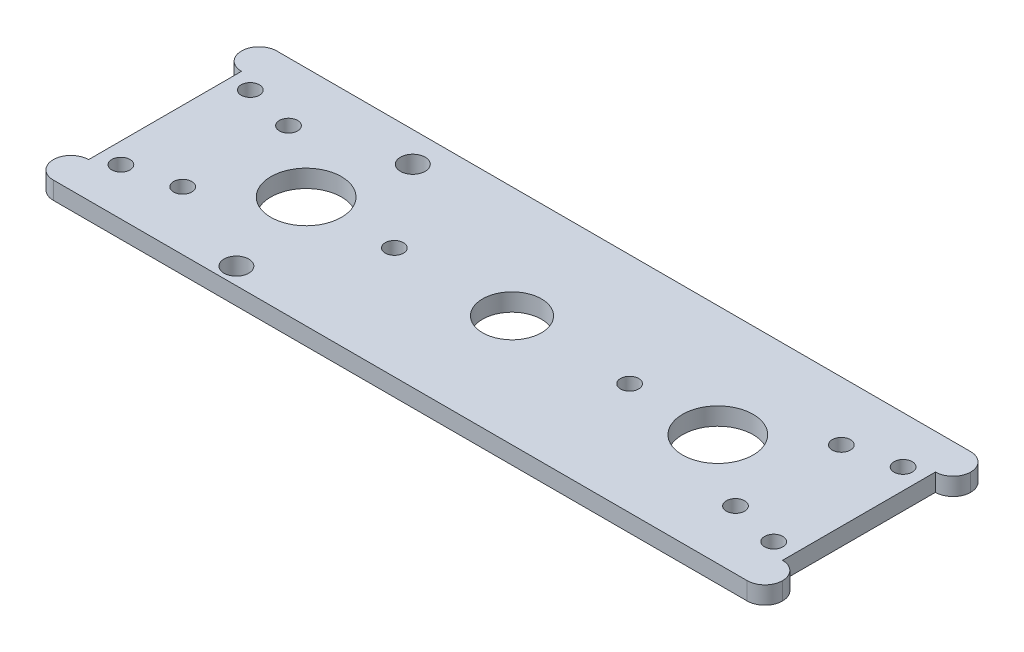
ISO-10303-21;
HEADER;
FILE_DESCRIPTION(('STEP AP214'),'2;1');
FILE_NAME('part.step','',(''),(''),'','','');
FILE_SCHEMA(('AUTOMOTIVE_DESIGN { 1 0 10303 214 1 1 1 1 }'));
ENDSEC;
DATA;
#1=APPLICATION_CONTEXT('core data for automotive mechanical design processes');
#2=APPLICATION_PROTOCOL_DEFINITION('international standard','automotive_design',2000,#1);
#3=PRODUCT_CONTEXT('',#1,'mechanical');
#4=PRODUCT('Part','Part','',(#3));
#5=PRODUCT_RELATED_PRODUCT_CATEGORY('part','',(#4));
#6=PRODUCT_DEFINITION_FORMATION('','',#4);
#7=PRODUCT_DEFINITION_CONTEXT('part definition',#1,'design');
#8=PRODUCT_DEFINITION('design','',#6,#7);
#9=PRODUCT_DEFINITION_SHAPE('','',#8);
#10=(LENGTH_UNIT() NAMED_UNIT(*) SI_UNIT(.MILLI.,.METRE.));
#11=(NAMED_UNIT(*) PLANE_ANGLE_UNIT() SI_UNIT($,.RADIAN.));
#12=(NAMED_UNIT(*) SI_UNIT($,.STERADIAN.) SOLID_ANGLE_UNIT());
#13=UNCERTAINTY_MEASURE_WITH_UNIT(LENGTH_MEASURE(1.E-05),#10,'distance_accuracy_value','');
#14=(GEOMETRIC_REPRESENTATION_CONTEXT(3) GLOBAL_UNCERTAINTY_ASSIGNED_CONTEXT((#13)) GLOBAL_UNIT_ASSIGNED_CONTEXT((#10,
#11,#12)) REPRESENTATION_CONTEXT('',''));
#15=CARTESIAN_POINT('',(0.,0.,0.));
#16=DIRECTION('',(0.,0.,1.));
#17=DIRECTION('',(1.,0.,0.));
#18=AXIS2_PLACEMENT_3D('',#15,#16,#17);
#19=CARTESIAN_POINT('',(0.,3.,0.));
#20=DIRECTION('',(0.,-1.,0.));
#21=DIRECTION('',(0.,0.,-1.));
#22=AXIS2_PLACEMENT_3D('',#19,#20,#21);
#23=PLANE('',#22);
#24=CARTESIAN_POINT('',(-30.748546153319,3.,-13.8850052095709));
#25=DIRECTION('',(0.,-1.,0.));
#26=DIRECTION('',(0.,0.,-1.));
#27=AXIS2_PLACEMENT_3D('',#24,#25,#26);
#28=CIRCLE('',#27,2.09999999999999);
#29=CARTESIAN_POINT('',(-30.748546153319,3.,-15.9850052095709));
#30=VERTEX_POINT('',#29);
#31=EDGE_CURVE('E194',#30,#30,#28,.T.);
#32=ORIENTED_EDGE('',*,*,#31,.T.);
#33=EDGE_LOOP('',(#32));
#34=FACE_BOUND('',#33,.T.);
#35=CARTESIAN_POINT('',(-30.748546153319,3.,16.1149947904292));
#36=DIRECTION('',(0.,-1.,0.));
#37=DIRECTION('',(0.,0.,-1.));
#38=AXIS2_PLACEMENT_3D('',#35,#36,#37);
#39=CIRCLE('',#38,2.09999999999999);
#40=CARTESIAN_POINT('',(-30.748546153319,3.,14.0149947904292));
#41=VERTEX_POINT('',#40);
#42=EDGE_CURVE('E199',#41,#41,#39,.T.);
#43=ORIENTED_EDGE('',*,*,#42,.T.);
#44=EDGE_LOOP('',(#43));
#45=FACE_BOUND('',#44,.T.);
#46=DIRECTION('',(-1.,0.,0.));
#47=VECTOR('',#46,1.);
#48=CARTESIAN_POINT('',(-62.,3.,-19.));
#49=LINE('',#48,#47);
#50=CARTESIAN_POINT('',(59.,3.,-19.));
#51=VERTEX_POINT('',#50);
#52=CARTESIAN_POINT('',(-59.,3.,-19.));
#53=VERTEX_POINT('',#52);
#54=EDGE_CURVE('E143',#51,#53,#49,.T.);
#55=ORIENTED_EDGE('',*,*,#54,.T.);
#56=CARTESIAN_POINT('',(-59.,3.,-16.));
#57=DIRECTION('',(0.,-1.,0.));
#58=DIRECTION('',(0.,0.,-1.));
#59=AXIS2_PLACEMENT_3D('',#56,#57,#58);
#60=CIRCLE('',#59,3.);
#61=CARTESIAN_POINT('',(-62.,3.,-16.));
#62=VERTEX_POINT('',#61);
#63=EDGE_CURVE('E128',#53,#62,#60,.F.);
#64=ORIENTED_EDGE('',*,*,#63,.T.);
#65=CARTESIAN_POINT('',(-59.,3.,-16.));
#66=DIRECTION('',(0.,-1.,0.));
#67=DIRECTION('',(0.,0.,-1.));
#68=AXIS2_PLACEMENT_3D('',#65,#66,#67);
#69=CIRCLE('',#68,3.);
#70=CARTESIAN_POINT('',(-59.,3.,-13.));
#71=VERTEX_POINT('',#70);
#72=EDGE_CURVE('E122',#62,#71,#69,.F.);
#73=ORIENTED_EDGE('',*,*,#72,.T.);
#74=DIRECTION('',(0.,0.,1.));
#75=VECTOR('',#74,1.);
#76=CARTESIAN_POINT('',(-59.,3.,-13.));
#77=LINE('',#76,#75);
#78=CARTESIAN_POINT('',(-59.,3.,13.));
#79=VERTEX_POINT('',#78);
#80=EDGE_CURVE('E126',#71,#79,#77,.T.);
#81=ORIENTED_EDGE('',*,*,#80,.T.);
#82=CARTESIAN_POINT('',(-59.,3.,16.));
#83=DIRECTION('',(0.,-1.,0.));
#84=DIRECTION('',(0.,0.,-1.));
#85=AXIS2_PLACEMENT_3D('',#82,#83,#84);
#86=CIRCLE('',#85,3.);
#87=CARTESIAN_POINT('',(-62.,3.,16.));
#88=VERTEX_POINT('',#87);
#89=EDGE_CURVE('E133',#79,#88,#86,.F.);
#90=ORIENTED_EDGE('',*,*,#89,.T.);
#91=CARTESIAN_POINT('',(-59.,3.,16.));
#92=DIRECTION('',(0.,-1.,0.));
#93=DIRECTION('',(0.,0.,-1.));
#94=AXIS2_PLACEMENT_3D('',#91,#92,#93);
#95=CIRCLE('',#94,3.);
#96=CARTESIAN_POINT('',(-59.,3.,19.));
#97=VERTEX_POINT('',#96);
#98=EDGE_CURVE('E180',#88,#97,#95,.F.);
#99=ORIENTED_EDGE('',*,*,#98,.T.);
#100=DIRECTION('',(1.,0.,0.));
#101=VECTOR('',#100,1.);
#102=CARTESIAN_POINT('',(-62.,3.,19.));
#103=LINE('',#102,#101);
#104=CARTESIAN_POINT('',(59.,3.,19.));
#105=VERTEX_POINT('',#104);
#106=EDGE_CURVE('E142',#97,#105,#103,.T.);
#107=ORIENTED_EDGE('',*,*,#106,.T.);
#108=CARTESIAN_POINT('',(59.,3.,16.));
#109=DIRECTION('',(0.,-1.,0.));
#110=DIRECTION('',(0.,0.,-1.));
#111=AXIS2_PLACEMENT_3D('',#108,#109,#110);
#112=CIRCLE('',#111,3.);
#113=CARTESIAN_POINT('',(62.,3.,16.));
#114=VERTEX_POINT('',#113);
#115=EDGE_CURVE('E50',#105,#114,#112,.F.);
#116=ORIENTED_EDGE('',*,*,#115,.T.);
#117=CARTESIAN_POINT('',(59.,3.,16.));
#118=DIRECTION('',(0.,-1.,0.));
#119=DIRECTION('',(0.,0.,-1.));
#120=AXIS2_PLACEMENT_3D('',#117,#118,#119);
#121=CIRCLE('',#120,3.);
#122=CARTESIAN_POINT('',(59.,3.,13.));
#123=VERTEX_POINT('',#122);
#124=EDGE_CURVE('E177',#114,#123,#121,.F.);
#125=ORIENTED_EDGE('',*,*,#124,.T.);
#126=DIRECTION('',(0.,0.,-1.));
#127=VECTOR('',#126,1.);
#128=CARTESIAN_POINT('',(59.,3.,-13.));
#129=LINE('',#128,#127);
#130=CARTESIAN_POINT('',(59.,3.,-13.));
#131=VERTEX_POINT('',#130);
#132=EDGE_CURVE('E289',#123,#131,#129,.T.);
#133=ORIENTED_EDGE('',*,*,#132,.T.);
#134=CARTESIAN_POINT('',(59.,3.,-16.));
#135=DIRECTION('',(0.,-1.,0.));
#136=DIRECTION('',(0.,0.,-1.));
#137=AXIS2_PLACEMENT_3D('',#134,#135,#136);
#138=CIRCLE('',#137,3.);
#139=CARTESIAN_POINT('',(62.,3.,-16.));
#140=VERTEX_POINT('',#139);
#141=EDGE_CURVE('E175',#131,#140,#138,.F.);
#142=ORIENTED_EDGE('',*,*,#141,.T.);
#143=CARTESIAN_POINT('',(59.,3.,-16.));
#144=DIRECTION('',(0.,-1.,0.));
#145=DIRECTION('',(0.,0.,-1.));
#146=AXIS2_PLACEMENT_3D('',#143,#144,#145);
#147=CIRCLE('',#146,3.);
#148=EDGE_CURVE('E173',#140,#51,#147,.F.);
#149=ORIENTED_EDGE('',*,*,#148,.T.);
#150=EDGE_LOOP('',(#55,#64,#73,#81,#90,#99,#107,#116,#125,#133,#142,#149));
#151=FACE_BOUND('',#150,.T.);
#152=CARTESIAN_POINT('',(0.,3.,0.));
#153=DIRECTION('',(0.,1.,0.));
#154=DIRECTION('',(0.,0.,1.));
#155=AXIS2_PLACEMENT_3D('',#152,#153,#154);
#156=CIRCLE('',#155,5.);
#157=CARTESIAN_POINT('',(0.,3.,5.));
#158=VERTEX_POINT('',#157);
#159=EDGE_CURVE('E280',#158,#158,#156,.T.);
#160=ORIENTED_EDGE('',*,*,#159,.F.);
#161=EDGE_LOOP('',(#160));
#162=FACE_BOUND('',#161,.T.);
#163=CARTESIAN_POINT('',(55.5,3.,-11.));
#164=DIRECTION('',(0.,1.,0.));
#165=DIRECTION('',(0.,0.,1.));
#166=AXIS2_PLACEMENT_3D('',#163,#164,#165);
#167=CIRCLE('',#166,1.54999999999999);
#168=CARTESIAN_POINT('',(55.5,3.,-9.45));
#169=VERTEX_POINT('',#168);
#170=EDGE_CURVE('E274',#169,#169,#167,.T.);
#171=ORIENTED_EDGE('',*,*,#170,.F.);
#172=EDGE_LOOP('',(#171));
#173=FACE_BOUND('',#172,.T.);
#174=CARTESIAN_POINT('',(-55.5,3.,-11.));
#175=DIRECTION('',(0.,1.,0.));
#176=DIRECTION('',(0.,0.,-1.));
#177=AXIS2_PLACEMENT_3D('',#174,#175,#176);
#178=CIRCLE('',#177,1.54999999999999);
#179=CARTESIAN_POINT('',(-55.5,3.,-12.55));
#180=VERTEX_POINT('',#179);
#181=EDGE_CURVE('E268',#180,#180,#178,.T.);
#182=ORIENTED_EDGE('',*,*,#181,.F.);
#183=EDGE_LOOP('',(#182));
#184=FACE_BOUND('',#183,.T.);
#185=CARTESIAN_POINT('',(-55.5,3.,11.));
#186=DIRECTION('',(0.,1.,0.));
#187=DIRECTION('',(0.,0.,1.));
#188=AXIS2_PLACEMENT_3D('',#185,#186,#187);
#189=CIRCLE('',#188,1.54999999999999);
#190=CARTESIAN_POINT('',(-55.5,3.,12.55));
#191=VERTEX_POINT('',#190);
#192=EDGE_CURVE('E262',#191,#191,#189,.T.);
#193=ORIENTED_EDGE('',*,*,#192,.F.);
#194=EDGE_LOOP('',(#193));
#195=FACE_BOUND('',#194,.T.);
#196=CARTESIAN_POINT('',(55.5,3.,11.));
#197=DIRECTION('',(0.,1.,0.));
#198=DIRECTION('',(0.,0.,-1.));
#199=AXIS2_PLACEMENT_3D('',#196,#197,#198);
#200=CIRCLE('',#199,1.54999999999999);
#201=CARTESIAN_POINT('',(55.5,3.,9.45));
#202=VERTEX_POINT('',#201);
#203=EDGE_CURVE('E256',#202,#202,#200,.T.);
#204=ORIENTED_EDGE('',*,*,#203,.F.);
#205=EDGE_LOOP('',(#204));
#206=FACE_BOUND('',#205,.T.);
#207=CARTESIAN_POINT('',(20.,3.,0.));
#208=DIRECTION('',(0.,1.,0.));
#209=DIRECTION('',(0.,0.,1.));
#210=AXIS2_PLACEMENT_3D('',#207,#208,#209);
#211=CIRCLE('',#210,1.55);
#212=CARTESIAN_POINT('',(20.,3.,1.55));
#213=VERTEX_POINT('',#212);
#214=EDGE_CURVE('E250',#213,#213,#211,.T.);
#215=ORIENTED_EDGE('',*,*,#214,.F.);
#216=EDGE_LOOP('',(#215));
#217=FACE_BOUND('',#216,.T.);
#218=CARTESIAN_POINT('',(-20.,3.,0.));
#219=DIRECTION('',(0.,1.,0.));
#220=DIRECTION('',(0.,0.,-1.));
#221=AXIS2_PLACEMENT_3D('',#218,#219,#220);
#222=CIRCLE('',#221,1.55);
#223=CARTESIAN_POINT('',(-20.,3.,-1.55));
#224=VERTEX_POINT('',#223);
#225=EDGE_CURVE('E244',#224,#224,#222,.T.);
#226=ORIENTED_EDGE('',*,*,#225,.F.);
#227=EDGE_LOOP('',(#226));
#228=FACE_BOUND('',#227,.T.);
#229=CARTESIAN_POINT('',(35.,3.,0.));
#230=DIRECTION('',(0.,1.,0.));
#231=DIRECTION('',(0.,0.,1.));
#232=AXIS2_PLACEMENT_3D('',#229,#230,#231);
#233=CIRCLE('',#232,6.);
#234=CARTESIAN_POINT('',(35.,3.,6.));
#235=VERTEX_POINT('',#234);
#236=EDGE_CURVE('E238',#235,#235,#233,.T.);
#237=ORIENTED_EDGE('',*,*,#236,.F.);
#238=EDGE_LOOP('',(#237));
#239=FACE_BOUND('',#238,.T.);
#240=CARTESIAN_POINT('',(-35.,3.,0.));
#241=DIRECTION('',(0.,1.,0.));
#242=DIRECTION('',(0.,0.,-1.));
#243=AXIS2_PLACEMENT_3D('',#240,#241,#242);
#244=CIRCLE('',#243,6.);
#245=CARTESIAN_POINT('',(-35.,3.,-6.));
#246=VERTEX_POINT('',#245);
#247=EDGE_CURVE('E232',#246,#246,#244,.T.);
#248=ORIENTED_EDGE('',*,*,#247,.F.);
#249=EDGE_LOOP('',(#248));
#250=FACE_BOUND('',#249,.T.);
#251=CARTESIAN_POINT('',(47.,3.,-9.));
#252=DIRECTION('',(0.,1.,0.));
#253=DIRECTION('',(0.,0.,1.));
#254=AXIS2_PLACEMENT_3D('',#251,#252,#253);
#255=CIRCLE('',#254,1.55);
#256=CARTESIAN_POINT('',(47.,3.,-7.45));
#257=VERTEX_POINT('',#256);
#258=EDGE_CURVE('E226',#257,#257,#255,.T.);
#259=ORIENTED_EDGE('',*,*,#258,.F.);
#260=EDGE_LOOP('',(#259));
#261=FACE_BOUND('',#260,.T.);
#262=CARTESIAN_POINT('',(47.,3.,9.));
#263=DIRECTION('',(0.,1.,0.));
#264=DIRECTION('',(0.,0.,-1.));
#265=AXIS2_PLACEMENT_3D('',#262,#263,#264);
#266=CIRCLE('',#265,1.55);
#267=CARTESIAN_POINT('',(47.,3.,7.45));
#268=VERTEX_POINT('',#267);
#269=EDGE_CURVE('E220',#268,#268,#266,.T.);
#270=ORIENTED_EDGE('',*,*,#269,.F.);
#271=EDGE_LOOP('',(#270));
#272=FACE_BOUND('',#271,.T.);
#273=CARTESIAN_POINT('',(-47.,3.,9.));
#274=DIRECTION('',(0.,1.,0.));
#275=DIRECTION('',(0.,0.,1.));
#276=AXIS2_PLACEMENT_3D('',#273,#274,#275);
#277=CIRCLE('',#276,1.55);
#278=CARTESIAN_POINT('',(-47.,3.,10.55));
#279=VERTEX_POINT('',#278);
#280=EDGE_CURVE('E214',#279,#279,#277,.T.);
#281=ORIENTED_EDGE('',*,*,#280,.F.);
#282=EDGE_LOOP('',(#281));
#283=FACE_BOUND('',#282,.T.);
#284=CARTESIAN_POINT('',(-47.,3.,-9.));
#285=DIRECTION('',(0.,1.,0.));
#286=DIRECTION('',(0.,0.,-1.));
#287=AXIS2_PLACEMENT_3D('',#284,#285,#286);
#288=CIRCLE('',#287,1.55);
#289=CARTESIAN_POINT('',(-47.,3.,-10.55));
#290=VERTEX_POINT('',#289);
#291=EDGE_CURVE('E208',#290,#290,#288,.T.);
#292=ORIENTED_EDGE('',*,*,#291,.F.);
#293=EDGE_LOOP('',(#292));
#294=FACE_BOUND('',#293,.T.);
#295=ADVANCED_FACE('F33',(#34,#45,#151,#162,#173,#184,#195,#206,#217,#228,#239,#250,#261,#272,
#283,#294),#23,.F.);
#296=CARTESIAN_POINT('',(0.,0.,0.));
#297=DIRECTION('',(0.,-1.,0.));
#298=DIRECTION('',(0.,0.,-1.));
#299=AXIS2_PLACEMENT_3D('',#296,#297,#298);
#300=PLANE('',#299);
#301=CARTESIAN_POINT('',(-30.748546153319,0.,-13.8850052095709));
#302=DIRECTION('',(0.,-1.,0.));
#303=DIRECTION('',(0.,0.,-1.));
#304=AXIS2_PLACEMENT_3D('',#301,#302,#303);
#305=CIRCLE('',#304,2.09999999999999);
#306=CARTESIAN_POINT('',(-30.748546153319,0.,-15.9850052095709));
#307=VERTEX_POINT('',#306);
#308=EDGE_CURVE('E204',#307,#307,#305,.T.);
#309=ORIENTED_EDGE('',*,*,#308,.F.);
#310=EDGE_LOOP('',(#309));
#311=FACE_BOUND('',#310,.T.);
#312=CARTESIAN_POINT('',(-30.748546153319,0.,16.1149947904292));
#313=DIRECTION('',(0.,-1.,0.));
#314=DIRECTION('',(0.,0.,-1.));
#315=AXIS2_PLACEMENT_3D('',#312,#313,#314);
#316=CIRCLE('',#315,2.09999999999999);
#317=CARTESIAN_POINT('',(-30.748546153319,0.,14.0149947904292));
#318=VERTEX_POINT('',#317);
#319=EDGE_CURVE('E539',#318,#318,#316,.T.);
#320=ORIENTED_EDGE('',*,*,#319,.F.);
#321=EDGE_LOOP('',(#320));
#322=FACE_BOUND('',#321,.T.);
#323=CARTESIAN_POINT('',(-47.,0.,9.));
#324=DIRECTION('',(0.,1.,0.));
#325=DIRECTION('',(0.,0.,1.));
#326=AXIS2_PLACEMENT_3D('',#323,#324,#325);
#327=CIRCLE('',#326,1.55);
#328=CARTESIAN_POINT('',(-47.,0.,10.55));
#329=VERTEX_POINT('',#328);
#330=EDGE_CURVE('E211',#329,#329,#327,.T.);
#331=ORIENTED_EDGE('',*,*,#330,.T.);
#332=EDGE_LOOP('',(#331));
#333=FACE_BOUND('',#332,.T.);
#334=CARTESIAN_POINT('',(47.,0.,-9.));
#335=DIRECTION('',(0.,1.,0.));
#336=DIRECTION('',(0.,0.,1.));
#337=AXIS2_PLACEMENT_3D('',#334,#335,#336);
#338=CIRCLE('',#337,1.55);
#339=CARTESIAN_POINT('',(47.,0.,-7.45));
#340=VERTEX_POINT('',#339);
#341=EDGE_CURVE('E223',#340,#340,#338,.T.);
#342=ORIENTED_EDGE('',*,*,#341,.T.);
#343=EDGE_LOOP('',(#342));
#344=FACE_BOUND('',#343,.T.);
#345=CARTESIAN_POINT('',(35.,0.,0.));
#346=DIRECTION('',(0.,1.,0.));
#347=DIRECTION('',(0.,0.,1.));
#348=AXIS2_PLACEMENT_3D('',#345,#346,#347);
#349=CIRCLE('',#348,6.);
#350=CARTESIAN_POINT('',(35.,0.,6.));
#351=VERTEX_POINT('',#350);
#352=EDGE_CURVE('E235',#351,#351,#349,.T.);
#353=ORIENTED_EDGE('',*,*,#352,.T.);
#354=EDGE_LOOP('',(#353));
#355=FACE_BOUND('',#354,.T.);
#356=CARTESIAN_POINT('',(20.,0.,0.));
#357=DIRECTION('',(0.,1.,0.));
#358=DIRECTION('',(0.,0.,1.));
#359=AXIS2_PLACEMENT_3D('',#356,#357,#358);
#360=CIRCLE('',#359,1.55);
#361=CARTESIAN_POINT('',(20.,0.,1.55));
#362=VERTEX_POINT('',#361);
#363=EDGE_CURVE('E247',#362,#362,#360,.T.);
#364=ORIENTED_EDGE('',*,*,#363,.T.);
#365=EDGE_LOOP('',(#364));
#366=FACE_BOUND('',#365,.T.);
#367=CARTESIAN_POINT('',(-55.5,0.,11.));
#368=DIRECTION('',(0.,1.,0.));
#369=DIRECTION('',(0.,0.,1.));
#370=AXIS2_PLACEMENT_3D('',#367,#368,#369);
#371=CIRCLE('',#370,1.54999999999999);
#372=CARTESIAN_POINT('',(-55.5,0.,12.55));
#373=VERTEX_POINT('',#372);
#374=EDGE_CURVE('E259',#373,#373,#371,.T.);
#375=ORIENTED_EDGE('',*,*,#374,.T.);
#376=EDGE_LOOP('',(#375));
#377=FACE_BOUND('',#376,.T.);
#378=CARTESIAN_POINT('',(55.5,0.,-11.));
#379=DIRECTION('',(0.,1.,0.));
#380=DIRECTION('',(0.,0.,1.));
#381=AXIS2_PLACEMENT_3D('',#378,#379,#380);
#382=CIRCLE('',#381,1.54999999999999);
#383=CARTESIAN_POINT('',(55.5,0.,-9.45));
#384=VERTEX_POINT('',#383);
#385=EDGE_CURVE('E271',#384,#384,#382,.T.);
#386=ORIENTED_EDGE('',*,*,#385,.T.);
#387=EDGE_LOOP('',(#386));
#388=FACE_BOUND('',#387,.T.);
#389=CARTESIAN_POINT('',(-59.,0.,-16.));
#390=DIRECTION('',(0.,-1.,0.));
#391=DIRECTION('',(0.,0.,-1.));
#392=AXIS2_PLACEMENT_3D('',#389,#390,#391);
#393=CIRCLE('',#392,3.);
#394=CARTESIAN_POINT('',(-59.,0.,-13.));
#395=VERTEX_POINT('',#394);
#396=CARTESIAN_POINT('',(-62.,0.,-16.));
#397=VERTEX_POINT('',#396);
#398=EDGE_CURVE('E147',#395,#397,#393,.T.);
#399=ORIENTED_EDGE('',*,*,#398,.T.);
#400=CARTESIAN_POINT('',(-59.,0.,-16.));
#401=DIRECTION('',(0.,-1.,0.));
#402=DIRECTION('',(0.,0.,-1.));
#403=AXIS2_PLACEMENT_3D('',#400,#401,#402);
#404=CIRCLE('',#403,3.);
#405=CARTESIAN_POINT('',(-59.,0.,-19.));
#406=VERTEX_POINT('',#405);
#407=EDGE_CURVE('E166',#397,#406,#404,.T.);
#408=ORIENTED_EDGE('',*,*,#407,.T.);
#409=DIRECTION('',(-1.,0.,0.));
#410=VECTOR('',#409,1.);
#411=CARTESIAN_POINT('',(-62.,0.,-19.));
#412=LINE('',#411,#410);
#413=CARTESIAN_POINT('',(59.,0.,-19.));
#414=VERTEX_POINT('',#413);
#415=EDGE_CURVE('E283',#414,#406,#412,.T.);
#416=ORIENTED_EDGE('',*,*,#415,.F.);
#417=CARTESIAN_POINT('',(59.,0.,-16.));
#418=DIRECTION('',(0.,-1.,0.));
#419=DIRECTION('',(0.,0.,-1.));
#420=AXIS2_PLACEMENT_3D('',#417,#418,#419);
#421=CIRCLE('',#420,3.);
#422=CARTESIAN_POINT('',(62.,0.,-16.));
#423=VERTEX_POINT('',#422);
#424=EDGE_CURVE('E148',#414,#423,#421,.T.);
#425=ORIENTED_EDGE('',*,*,#424,.T.);
#426=CARTESIAN_POINT('',(59.,0.,-16.));
#427=DIRECTION('',(0.,-1.,0.));
#428=DIRECTION('',(0.,0.,-1.));
#429=AXIS2_PLACEMENT_3D('',#426,#427,#428);
#430=CIRCLE('',#429,3.);
#431=CARTESIAN_POINT('',(59.,0.,-13.));
#432=VERTEX_POINT('',#431);
#433=EDGE_CURVE('E150',#423,#432,#430,.T.);
#434=ORIENTED_EDGE('',*,*,#433,.T.);
#435=DIRECTION('',(0.,0.,-1.));
#436=VECTOR('',#435,1.);
#437=CARTESIAN_POINT('',(59.,0.,-13.));
#438=LINE('',#437,#436);
#439=CARTESIAN_POINT('',(59.,0.,13.));
#440=VERTEX_POINT('',#439);
#441=EDGE_CURVE('E286',#440,#432,#438,.T.);
#442=ORIENTED_EDGE('',*,*,#441,.F.);
#443=CARTESIAN_POINT('',(59.,0.,16.));
#444=DIRECTION('',(0.,-1.,0.));
#445=DIRECTION('',(0.,0.,-1.));
#446=AXIS2_PLACEMENT_3D('',#443,#444,#445);
#447=CIRCLE('',#446,3.);
#448=CARTESIAN_POINT('',(62.,0.,16.));
#449=VERTEX_POINT('',#448);
#450=EDGE_CURVE('E157',#440,#449,#447,.T.);
#451=ORIENTED_EDGE('',*,*,#450,.T.);
#452=CARTESIAN_POINT('',(59.,0.,16.));
#453=DIRECTION('',(0.,-1.,0.));
#454=DIRECTION('',(0.,0.,-1.));
#455=AXIS2_PLACEMENT_3D('',#452,#453,#454);
#456=CIRCLE('',#455,3.);
#457=CARTESIAN_POINT('',(59.,0.,19.));
#458=VERTEX_POINT('',#457);
#459=EDGE_CURVE('E159',#449,#458,#456,.T.);
#460=ORIENTED_EDGE('',*,*,#459,.T.);
#461=DIRECTION('',(1.,0.,0.));
#462=VECTOR('',#461,1.);
#463=CARTESIAN_POINT('',(-62.,0.,19.));
#464=LINE('',#463,#462);
#465=CARTESIAN_POINT('',(-59.,0.,19.));
#466=VERTEX_POINT('',#465);
#467=EDGE_CURVE('E297',#466,#458,#464,.T.);
#468=ORIENTED_EDGE('',*,*,#467,.F.);
#469=CARTESIAN_POINT('',(-59.,0.,16.));
#470=DIRECTION('',(0.,-1.,0.));
#471=DIRECTION('',(0.,0.,-1.));
#472=AXIS2_PLACEMENT_3D('',#469,#470,#471);
#473=CIRCLE('',#472,3.);
#474=CARTESIAN_POINT('',(-62.,0.,16.));
#475=VERTEX_POINT('',#474);
#476=EDGE_CURVE('E161',#466,#475,#473,.T.);
#477=ORIENTED_EDGE('',*,*,#476,.T.);
#478=CARTESIAN_POINT('',(-59.,0.,16.));
#479=DIRECTION('',(0.,-1.,0.));
#480=DIRECTION('',(0.,0.,-1.));
#481=AXIS2_PLACEMENT_3D('',#478,#479,#480);
#482=CIRCLE('',#481,3.);
#483=CARTESIAN_POINT('',(-59.,0.,13.));
#484=VERTEX_POINT('',#483);
#485=EDGE_CURVE('E163',#475,#484,#482,.T.);
#486=ORIENTED_EDGE('',*,*,#485,.T.);
#487=DIRECTION('',(0.,0.,1.));
#488=VECTOR('',#487,1.);
#489=CARTESIAN_POINT('',(-59.,0.,-13.));
#490=LINE('',#489,#488);
#491=EDGE_CURVE('E295',#395,#484,#490,.T.);
#492=ORIENTED_EDGE('',*,*,#491,.F.);
#493=EDGE_LOOP('',(#399,#408,#416,#425,#434,#442,#451,#460,#468,#477,#486,#492));
#494=FACE_BOUND('',#493,.T.);
#495=CARTESIAN_POINT('',(0.,0.,0.));
#496=DIRECTION('',(0.,1.,0.));
#497=DIRECTION('',(0.,0.,1.));
#498=AXIS2_PLACEMENT_3D('',#495,#496,#497);
#499=CIRCLE('',#498,5.);
#500=CARTESIAN_POINT('',(0.,0.,5.));
#501=VERTEX_POINT('',#500);
#502=EDGE_CURVE('E277',#501,#501,#499,.T.);
#503=ORIENTED_EDGE('',*,*,#502,.T.);
#504=EDGE_LOOP('',(#503));
#505=FACE_BOUND('',#504,.T.);
#506=CARTESIAN_POINT('',(-55.5,0.,-11.));
#507=DIRECTION('',(0.,1.,0.));
#508=DIRECTION('',(0.,0.,-1.));
#509=AXIS2_PLACEMENT_3D('',#506,#507,#508);
#510=CIRCLE('',#509,1.54999999999999);
#511=CARTESIAN_POINT('',(-55.5,0.,-12.55));
#512=VERTEX_POINT('',#511);
#513=EDGE_CURVE('E265',#512,#512,#510,.T.);
#514=ORIENTED_EDGE('',*,*,#513,.T.);
#515=EDGE_LOOP('',(#514));
#516=FACE_BOUND('',#515,.T.);
#517=CARTESIAN_POINT('',(55.5,0.,11.));
#518=DIRECTION('',(0.,1.,0.));
#519=DIRECTION('',(0.,0.,-1.));
#520=AXIS2_PLACEMENT_3D('',#517,#518,#519);
#521=CIRCLE('',#520,1.54999999999999);
#522=CARTESIAN_POINT('',(55.5,0.,9.45));
#523=VERTEX_POINT('',#522);
#524=EDGE_CURVE('E253',#523,#523,#521,.T.);
#525=ORIENTED_EDGE('',*,*,#524,.T.);
#526=EDGE_LOOP('',(#525));
#527=FACE_BOUND('',#526,.T.);
#528=CARTESIAN_POINT('',(-20.,0.,0.));
#529=DIRECTION('',(0.,1.,0.));
#530=DIRECTION('',(0.,0.,-1.));
#531=AXIS2_PLACEMENT_3D('',#528,#529,#530);
#532=CIRCLE('',#531,1.55);
#533=CARTESIAN_POINT('',(-20.,0.,-1.55));
#534=VERTEX_POINT('',#533);
#535=EDGE_CURVE('E241',#534,#534,#532,.T.);
#536=ORIENTED_EDGE('',*,*,#535,.T.);
#537=EDGE_LOOP('',(#536));
#538=FACE_BOUND('',#537,.T.);
#539=CARTESIAN_POINT('',(-35.,0.,0.));
#540=DIRECTION('',(0.,1.,0.));
#541=DIRECTION('',(0.,0.,-1.));
#542=AXIS2_PLACEMENT_3D('',#539,#540,#541);
#543=CIRCLE('',#542,6.);
#544=CARTESIAN_POINT('',(-35.,0.,-6.));
#545=VERTEX_POINT('',#544);
#546=EDGE_CURVE('E229',#545,#545,#543,.T.);
#547=ORIENTED_EDGE('',*,*,#546,.T.);
#548=EDGE_LOOP('',(#547));
#549=FACE_BOUND('',#548,.T.);
#550=CARTESIAN_POINT('',(47.,0.,9.));
#551=DIRECTION('',(0.,1.,0.));
#552=DIRECTION('',(0.,0.,-1.));
#553=AXIS2_PLACEMENT_3D('',#550,#551,#552);
#554=CIRCLE('',#553,1.55);
#555=CARTESIAN_POINT('',(47.,0.,7.45));
#556=VERTEX_POINT('',#555);
#557=EDGE_CURVE('E217',#556,#556,#554,.T.);
#558=ORIENTED_EDGE('',*,*,#557,.T.);
#559=EDGE_LOOP('',(#558));
#560=FACE_BOUND('',#559,.T.);
#561=CARTESIAN_POINT('',(-47.,0.,-9.));
#562=DIRECTION('',(0.,1.,0.));
#563=DIRECTION('',(0.,0.,-1.));
#564=AXIS2_PLACEMENT_3D('',#561,#562,#563);
#565=CIRCLE('',#564,1.55);
#566=CARTESIAN_POINT('',(-47.,0.,-10.55));
#567=VERTEX_POINT('',#566);
#568=EDGE_CURVE('E187',#567,#567,#565,.T.);
#569=ORIENTED_EDGE('',*,*,#568,.T.);
#570=EDGE_LOOP('',(#569));
#571=FACE_BOUND('',#570,.T.);
#572=ADVANCED_FACE('F312',(#311,#322,#333,#344,#355,#366,#377,#388,#494,#505,#516,#527,#538,
#549,#560,#571),#300,.T.);
#573=CARTESIAN_POINT('',(-62.,3.,-19.));
#574=DIRECTION('',(0.,0.,1.));
#575=DIRECTION('',(1.,0.,0.));
#576=AXIS2_PLACEMENT_3D('',#573,#574,#575);
#577=PLANE('',#576);
#578=ORIENTED_EDGE('',*,*,#415,.T.);
#579=DIRECTION('',(0.,-1.,0.));
#580=VECTOR('',#579,1.);
#581=CARTESIAN_POINT('',(-59.,3.,-19.));
#582=LINE('',#581,#580);
#583=EDGE_CURVE('E170',#406,#53,#582,.F.);
#584=ORIENTED_EDGE('',*,*,#583,.T.);
#585=ORIENTED_EDGE('',*,*,#54,.F.);
#586=DIRECTION('',(0.,-1.,0.));
#587=VECTOR('',#586,1.);
#588=CARTESIAN_POINT('',(59.,3.,-19.));
#589=LINE('',#588,#587);
#590=EDGE_CURVE('E168',#51,#414,#589,.T.);
#591=ORIENTED_EDGE('',*,*,#590,.T.);
#592=EDGE_LOOP('',(#578,#584,#585,#591));
#593=FACE_BOUND('',#592,.T.);
#594=ADVANCED_FACE('F345',(#593),#577,.F.);
#595=CARTESIAN_POINT('',(-59.,3.,-13.));
#596=DIRECTION('',(1.,0.,0.));
#597=DIRECTION('',(0.,0.,-1.));
#598=AXIS2_PLACEMENT_3D('',#595,#596,#597);
#599=PLANE('',#598);
#600=ORIENTED_EDGE('',*,*,#491,.T.);
#601=DIRECTION('',(0.,-1.,0.));
#602=VECTOR('',#601,1.);
#603=CARTESIAN_POINT('',(-59.,3.,13.));
#604=LINE('',#603,#602);
#605=EDGE_CURVE('E141',#79,#484,#604,.T.);
#606=ORIENTED_EDGE('',*,*,#605,.F.);
#607=ORIENTED_EDGE('',*,*,#80,.F.);
#608=DIRECTION('',(0.,-1.,0.));
#609=VECTOR('',#608,1.);
#610=CARTESIAN_POINT('',(-59.,3.,-13.));
#611=LINE('',#610,#609);
#612=EDGE_CURVE('E138',#71,#395,#611,.T.);
#613=ORIENTED_EDGE('',*,*,#612,.T.);
#614=EDGE_LOOP('',(#600,#606,#607,#613));
#615=FACE_BOUND('',#614,.T.);
#616=ADVANCED_FACE('F137',(#615),#599,.F.);
#617=CARTESIAN_POINT('',(-62.,3.,19.));
#618=DIRECTION('',(0.,0.,-1.));
#619=DIRECTION('',(-1.,0.,0.));
#620=AXIS2_PLACEMENT_3D('',#617,#618,#619);
#621=PLANE('',#620);
#622=ORIENTED_EDGE('',*,*,#106,.F.);
#623=DIRECTION('',(0.,-1.,0.));
#624=VECTOR('',#623,1.);
#625=CARTESIAN_POINT('',(-59.,3.,19.));
#626=LINE('',#625,#624);
#627=EDGE_CURVE('E11',#97,#466,#626,.T.);
#628=ORIENTED_EDGE('',*,*,#627,.T.);
#629=ORIENTED_EDGE('',*,*,#467,.T.);
#630=DIRECTION('',(0.,-1.,0.));
#631=VECTOR('',#630,1.);
#632=CARTESIAN_POINT('',(59.,3.,19.));
#633=LINE('',#632,#631);
#634=EDGE_CURVE('E42',#458,#105,#633,.F.);
#635=ORIENTED_EDGE('',*,*,#634,.T.);
#636=EDGE_LOOP('',(#622,#628,#629,#635));
#637=FACE_BOUND('',#636,.T.);
#638=ADVANCED_FACE('F320',(#637),#621,.F.);
#639=CARTESIAN_POINT('',(59.,3.,-13.));
#640=DIRECTION('',(-1.,0.,0.));
#641=DIRECTION('',(0.,0.,1.));
#642=AXIS2_PLACEMENT_3D('',#639,#640,#641);
#643=PLANE('',#642);
#644=ORIENTED_EDGE('',*,*,#441,.T.);
#645=DIRECTION('',(0.,-1.,0.));
#646=VECTOR('',#645,1.);
#647=CARTESIAN_POINT('',(59.,3.,-13.));
#648=LINE('',#647,#646);
#649=EDGE_CURVE('E292',#131,#432,#648,.T.);
#650=ORIENTED_EDGE('',*,*,#649,.F.);
#651=ORIENTED_EDGE('',*,*,#132,.F.);
#652=DIRECTION('',(0.,-1.,0.));
#653=VECTOR('',#652,1.);
#654=CARTESIAN_POINT('',(59.,3.,13.));
#655=LINE('',#654,#653);
#656=EDGE_CURVE('E152',#123,#440,#655,.T.);
#657=ORIENTED_EDGE('',*,*,#656,.T.);
#658=EDGE_LOOP('',(#644,#650,#651,#657));
#659=FACE_BOUND('',#658,.T.);
#660=ADVANCED_FACE('F307',(#659),#643,.F.);
#661=CARTESIAN_POINT('',(0.,3.,0.));
#662=DIRECTION('',(0.,-1.,0.));
#663=DIRECTION('',(0.,0.,-1.));
#664=AXIS2_PLACEMENT_3D('',#661,#662,#663);
#665=CYLINDRICAL_SURFACE('',#664,5.);
#666=ORIENTED_EDGE('',*,*,#159,.T.);
#667=EDGE_LOOP('',(#666));
#668=FACE_BOUND('',#667,.T.);
#669=ORIENTED_EDGE('',*,*,#502,.F.);
#670=EDGE_LOOP('',(#669));
#671=FACE_BOUND('',#670,.T.);
#672=ADVANCED_FACE('F350',(#668,#671),#665,.F.);
#673=CARTESIAN_POINT('',(55.5,3.,-11.));
#674=DIRECTION('',(0.,-1.,0.));
#675=DIRECTION('',(0.,0.,-1.));
#676=AXIS2_PLACEMENT_3D('',#673,#674,#675);
#677=CYLINDRICAL_SURFACE('',#676,1.54999999999999);
#678=ORIENTED_EDGE('',*,*,#170,.T.);
#679=EDGE_LOOP('',(#678));
#680=FACE_BOUND('',#679,.T.);
#681=ORIENTED_EDGE('',*,*,#385,.F.);
#682=EDGE_LOOP('',(#681));
#683=FACE_BOUND('',#682,.T.);
#684=ADVANCED_FACE('F416',(#680,#683),#677,.F.);
#685=CARTESIAN_POINT('',(-55.5,3.,-11.));
#686=DIRECTION('',(0.,-1.,0.));
#687=DIRECTION('',(0.,0.,-1.));
#688=AXIS2_PLACEMENT_3D('',#685,#686,#687);
#689=CYLINDRICAL_SURFACE('',#688,1.54999999999999);
#690=ORIENTED_EDGE('',*,*,#181,.T.);
#691=EDGE_LOOP('',(#690));
#692=FACE_BOUND('',#691,.T.);
#693=ORIENTED_EDGE('',*,*,#513,.F.);
#694=EDGE_LOOP('',(#693));
#695=FACE_BOUND('',#694,.T.);
#696=ADVANCED_FACE('F413',(#692,#695),#689,.F.);
#697=CARTESIAN_POINT('',(-55.5,3.,11.));
#698=DIRECTION('',(0.,-1.,0.));
#699=DIRECTION('',(0.,0.,-1.));
#700=AXIS2_PLACEMENT_3D('',#697,#698,#699);
#701=CYLINDRICAL_SURFACE('',#700,1.54999999999999);
#702=ORIENTED_EDGE('',*,*,#192,.T.);
#703=EDGE_LOOP('',(#702));
#704=FACE_BOUND('',#703,.T.);
#705=ORIENTED_EDGE('',*,*,#374,.F.);
#706=EDGE_LOOP('',(#705));
#707=FACE_BOUND('',#706,.T.);
#708=ADVANCED_FACE('F409',(#704,#707),#701,.F.);
#709=CARTESIAN_POINT('',(55.5,3.,11.));
#710=DIRECTION('',(0.,-1.,0.));
#711=DIRECTION('',(0.,0.,-1.));
#712=AXIS2_PLACEMENT_3D('',#709,#710,#711);
#713=CYLINDRICAL_SURFACE('',#712,1.54999999999999);
#714=ORIENTED_EDGE('',*,*,#203,.T.);
#715=EDGE_LOOP('',(#714));
#716=FACE_BOUND('',#715,.T.);
#717=ORIENTED_EDGE('',*,*,#524,.F.);
#718=EDGE_LOOP('',(#717));
#719=FACE_BOUND('',#718,.T.);
#720=ADVANCED_FACE('F405',(#716,#719),#713,.F.);
#721=CARTESIAN_POINT('',(20.,3.,0.));
#722=DIRECTION('',(0.,-1.,0.));
#723=DIRECTION('',(0.,0.,-1.));
#724=AXIS2_PLACEMENT_3D('',#721,#722,#723);
#725=CYLINDRICAL_SURFACE('',#724,1.55);
#726=ORIENTED_EDGE('',*,*,#214,.T.);
#727=EDGE_LOOP('',(#726));
#728=FACE_BOUND('',#727,.T.);
#729=ORIENTED_EDGE('',*,*,#363,.F.);
#730=EDGE_LOOP('',(#729));
#731=FACE_BOUND('',#730,.T.);
#732=ADVANCED_FACE('F401',(#728,#731),#725,.F.);
#733=CARTESIAN_POINT('',(-20.,3.,0.));
#734=DIRECTION('',(0.,-1.,0.));
#735=DIRECTION('',(0.,0.,-1.));
#736=AXIS2_PLACEMENT_3D('',#733,#734,#735);
#737=CYLINDRICAL_SURFACE('',#736,1.55);
#738=ORIENTED_EDGE('',*,*,#225,.T.);
#739=EDGE_LOOP('',(#738));
#740=FACE_BOUND('',#739,.T.);
#741=ORIENTED_EDGE('',*,*,#535,.F.);
#742=EDGE_LOOP('',(#741));
#743=FACE_BOUND('',#742,.T.);
#744=ADVANCED_FACE('F397',(#740,#743),#737,.F.);
#745=CARTESIAN_POINT('',(35.,3.,0.));
#746=DIRECTION('',(0.,-1.,0.));
#747=DIRECTION('',(0.,0.,-1.));
#748=AXIS2_PLACEMENT_3D('',#745,#746,#747);
#749=CYLINDRICAL_SURFACE('',#748,6.);
#750=ORIENTED_EDGE('',*,*,#236,.T.);
#751=EDGE_LOOP('',(#750));
#752=FACE_BOUND('',#751,.T.);
#753=ORIENTED_EDGE('',*,*,#352,.F.);
#754=EDGE_LOOP('',(#753));
#755=FACE_BOUND('',#754,.T.);
#756=ADVANCED_FACE('F393',(#752,#755),#749,.F.);
#757=CARTESIAN_POINT('',(-35.,3.,0.));
#758=DIRECTION('',(0.,-1.,0.));
#759=DIRECTION('',(0.,0.,-1.));
#760=AXIS2_PLACEMENT_3D('',#757,#758,#759);
#761=CYLINDRICAL_SURFACE('',#760,6.);
#762=ORIENTED_EDGE('',*,*,#247,.T.);
#763=EDGE_LOOP('',(#762));
#764=FACE_BOUND('',#763,.T.);
#765=ORIENTED_EDGE('',*,*,#546,.F.);
#766=EDGE_LOOP('',(#765));
#767=FACE_BOUND('',#766,.T.);
#768=ADVANCED_FACE('F389',(#764,#767),#761,.F.);
#769=CARTESIAN_POINT('',(47.,3.,-9.));
#770=DIRECTION('',(0.,-1.,0.));
#771=DIRECTION('',(0.,0.,-1.));
#772=AXIS2_PLACEMENT_3D('',#769,#770,#771);
#773=CYLINDRICAL_SURFACE('',#772,1.55);
#774=ORIENTED_EDGE('',*,*,#258,.T.);
#775=EDGE_LOOP('',(#774));
#776=FACE_BOUND('',#775,.T.);
#777=ORIENTED_EDGE('',*,*,#341,.F.);
#778=EDGE_LOOP('',(#777));
#779=FACE_BOUND('',#778,.T.);
#780=ADVANCED_FACE('F385',(#776,#779),#773,.F.);
#781=CARTESIAN_POINT('',(47.,3.,9.));
#782=DIRECTION('',(0.,-1.,0.));
#783=DIRECTION('',(0.,0.,-1.));
#784=AXIS2_PLACEMENT_3D('',#781,#782,#783);
#785=CYLINDRICAL_SURFACE('',#784,1.55);
#786=ORIENTED_EDGE('',*,*,#269,.T.);
#787=EDGE_LOOP('',(#786));
#788=FACE_BOUND('',#787,.T.);
#789=ORIENTED_EDGE('',*,*,#557,.F.);
#790=EDGE_LOOP('',(#789));
#791=FACE_BOUND('',#790,.T.);
#792=ADVANCED_FACE('F375',(#788,#791),#785,.F.);
#793=CARTESIAN_POINT('',(-47.,3.,9.));
#794=DIRECTION('',(0.,-1.,0.));
#795=DIRECTION('',(0.,0.,-1.));
#796=AXIS2_PLACEMENT_3D('',#793,#794,#795);
#797=CYLINDRICAL_SURFACE('',#796,1.55);
#798=ORIENTED_EDGE('',*,*,#280,.T.);
#799=EDGE_LOOP('',(#798));
#800=FACE_BOUND('',#799,.T.);
#801=ORIENTED_EDGE('',*,*,#330,.F.);
#802=EDGE_LOOP('',(#801));
#803=FACE_BOUND('',#802,.T.);
#804=ADVANCED_FACE('F369',(#800,#803),#797,.F.);
#805=CARTESIAN_POINT('',(-47.,3.,-9.));
#806=DIRECTION('',(0.,-1.,0.));
#807=DIRECTION('',(0.,0.,-1.));
#808=AXIS2_PLACEMENT_3D('',#805,#806,#807);
#809=CYLINDRICAL_SURFACE('',#808,1.55);
#810=ORIENTED_EDGE('',*,*,#291,.T.);
#811=EDGE_LOOP('',(#810));
#812=FACE_BOUND('',#811,.T.);
#813=ORIENTED_EDGE('',*,*,#568,.F.);
#814=EDGE_LOOP('',(#813));
#815=FACE_BOUND('',#814,.T.);
#816=ADVANCED_FACE('F365',(#812,#815),#809,.F.);
#817=CARTESIAN_POINT('',(-59.,3.,-16.));
#818=DIRECTION('',(0.,-1.,0.));
#819=DIRECTION('',(0.,0.,-1.));
#820=AXIS2_PLACEMENT_3D('',#817,#818,#819);
#821=CYLINDRICAL_SURFACE('',#820,3.);
#822=ORIENTED_EDGE('',*,*,#612,.F.);
#823=ORIENTED_EDGE('',*,*,#72,.F.);
#824=DIRECTION('',(0.,-1.,0.));
#825=VECTOR('',#824,1.);
#826=CARTESIAN_POINT('',(-62.,3.,-16.));
#827=LINE('',#826,#825);
#828=EDGE_CURVE('E185',#397,#62,#827,.F.);
#829=ORIENTED_EDGE('',*,*,#828,.F.);
#830=ORIENTED_EDGE('',*,*,#398,.F.);
#831=EDGE_LOOP('',(#822,#823,#829,#830));
#832=FACE_BOUND('',#831,.T.);
#833=ADVANCED_FACE('F146',(#832),#821,.T.);
#834=CARTESIAN_POINT('',(-59.,3.,-16.));
#835=DIRECTION('',(0.,-1.,0.));
#836=DIRECTION('',(0.,0.,-1.));
#837=AXIS2_PLACEMENT_3D('',#834,#835,#836);
#838=CYLINDRICAL_SURFACE('',#837,3.);
#839=ORIENTED_EDGE('',*,*,#63,.F.);
#840=ORIENTED_EDGE('',*,*,#583,.F.);
#841=ORIENTED_EDGE('',*,*,#407,.F.);
#842=ORIENTED_EDGE('',*,*,#828,.T.);
#843=EDGE_LOOP('',(#839,#840,#841,#842));
#844=FACE_BOUND('',#843,.T.);
#845=ADVANCED_FACE('F336',(#844),#838,.T.);
#846=CARTESIAN_POINT('',(-59.,3.,16.));
#847=DIRECTION('',(0.,-1.,0.));
#848=DIRECTION('',(0.,0.,-1.));
#849=AXIS2_PLACEMENT_3D('',#846,#847,#848);
#850=CYLINDRICAL_SURFACE('',#849,3.);
#851=ORIENTED_EDGE('',*,*,#627,.F.);
#852=ORIENTED_EDGE('',*,*,#98,.F.);
#853=DIRECTION('',(0.,-1.,0.));
#854=VECTOR('',#853,1.);
#855=CARTESIAN_POINT('',(-62.,3.,16.));
#856=LINE('',#855,#854);
#857=EDGE_CURVE('E188',#475,#88,#856,.F.);
#858=ORIENTED_EDGE('',*,*,#857,.F.);
#859=ORIENTED_EDGE('',*,*,#476,.F.);
#860=EDGE_LOOP('',(#851,#852,#858,#859));
#861=FACE_BOUND('',#860,.T.);
#862=ADVANCED_FACE('F324',(#861),#850,.T.);
#863=CARTESIAN_POINT('',(-59.,3.,16.));
#864=DIRECTION('',(0.,-1.,0.));
#865=DIRECTION('',(0.,0.,-1.));
#866=AXIS2_PLACEMENT_3D('',#863,#864,#865);
#867=CYLINDRICAL_SURFACE('',#866,3.);
#868=ORIENTED_EDGE('',*,*,#89,.F.);
#869=ORIENTED_EDGE('',*,*,#605,.T.);
#870=ORIENTED_EDGE('',*,*,#485,.F.);
#871=ORIENTED_EDGE('',*,*,#857,.T.);
#872=EDGE_LOOP('',(#868,#869,#870,#871));
#873=FACE_BOUND('',#872,.T.);
#874=ADVANCED_FACE('F328',(#873),#867,.T.);
#875=CARTESIAN_POINT('',(59.,3.,16.));
#876=DIRECTION('',(0.,-1.,0.));
#877=DIRECTION('',(0.,0.,-1.));
#878=AXIS2_PLACEMENT_3D('',#875,#876,#877);
#879=CYLINDRICAL_SURFACE('',#878,3.);
#880=ORIENTED_EDGE('',*,*,#656,.F.);
#881=ORIENTED_EDGE('',*,*,#124,.F.);
#882=DIRECTION('',(0.,-1.,0.));
#883=VECTOR('',#882,1.);
#884=CARTESIAN_POINT('',(62.,3.,16.));
#885=LINE('',#884,#883);
#886=EDGE_CURVE('E190',#449,#114,#885,.F.);
#887=ORIENTED_EDGE('',*,*,#886,.F.);
#888=ORIENTED_EDGE('',*,*,#450,.F.);
#889=EDGE_LOOP('',(#880,#881,#887,#888));
#890=FACE_BOUND('',#889,.T.);
#891=ADVANCED_FACE('F314',(#890),#879,.T.);
#892=CARTESIAN_POINT('',(59.,3.,16.));
#893=DIRECTION('',(0.,-1.,0.));
#894=DIRECTION('',(0.,0.,-1.));
#895=AXIS2_PLACEMENT_3D('',#892,#893,#894);
#896=CYLINDRICAL_SURFACE('',#895,3.);
#897=ORIENTED_EDGE('',*,*,#115,.F.);
#898=ORIENTED_EDGE('',*,*,#634,.F.);
#899=ORIENTED_EDGE('',*,*,#459,.F.);
#900=ORIENTED_EDGE('',*,*,#886,.T.);
#901=EDGE_LOOP('',(#897,#898,#899,#900));
#902=FACE_BOUND('',#901,.T.);
#903=ADVANCED_FACE('F315',(#902),#896,.T.);
#904=CARTESIAN_POINT('',(59.,3.,-16.));
#905=DIRECTION('',(0.,-1.,0.));
#906=DIRECTION('',(0.,0.,-1.));
#907=AXIS2_PLACEMENT_3D('',#904,#905,#906);
#908=CYLINDRICAL_SURFACE('',#907,3.);
#909=ORIENTED_EDGE('',*,*,#590,.F.);
#910=ORIENTED_EDGE('',*,*,#148,.F.);
#911=DIRECTION('',(0.,-1.,0.));
#912=VECTOR('',#911,1.);
#913=CARTESIAN_POINT('',(62.,3.,-16.));
#914=LINE('',#913,#912);
#915=EDGE_CURVE('E37',#423,#140,#914,.F.);
#916=ORIENTED_EDGE('',*,*,#915,.F.);
#917=ORIENTED_EDGE('',*,*,#424,.F.);
#918=EDGE_LOOP('',(#909,#910,#916,#917));
#919=FACE_BOUND('',#918,.T.);
#920=ADVANCED_FACE('F35',(#919),#908,.T.);
#921=CARTESIAN_POINT('',(59.,3.,-16.));
#922=DIRECTION('',(0.,-1.,0.));
#923=DIRECTION('',(0.,0.,-1.));
#924=AXIS2_PLACEMENT_3D('',#921,#922,#923);
#925=CYLINDRICAL_SURFACE('',#924,3.);
#926=ORIENTED_EDGE('',*,*,#141,.F.);
#927=ORIENTED_EDGE('',*,*,#649,.T.);
#928=ORIENTED_EDGE('',*,*,#433,.F.);
#929=ORIENTED_EDGE('',*,*,#915,.T.);
#930=EDGE_LOOP('',(#926,#927,#928,#929));
#931=FACE_BOUND('',#930,.T.);
#932=ADVANCED_FACE('F522',(#931),#925,.T.);
#933=CARTESIAN_POINT('',(-30.748546153319,10.,16.1149947904292));
#934=DIRECTION('',(0.,-1.,0.));
#935=DIRECTION('',(0.,0.,-1.));
#936=AXIS2_PLACEMENT_3D('',#933,#934,#935);
#937=CYLINDRICAL_SURFACE('',#936,2.09999999999999);
#938=ORIENTED_EDGE('',*,*,#319,.T.);
#939=EDGE_LOOP('',(#938));
#940=FACE_BOUND('',#939,.T.);
#941=ORIENTED_EDGE('',*,*,#42,.F.);
#942=EDGE_LOOP('',(#941));
#943=FACE_BOUND('',#942,.T.);
#944=ADVANCED_FACE('F380',(#940,#943),#937,.F.);
#945=CARTESIAN_POINT('',(-30.748546153319,10.,-13.8850052095709));
#946=DIRECTION('',(0.,-1.,0.));
#947=DIRECTION('',(0.,0.,-1.));
#948=AXIS2_PLACEMENT_3D('',#945,#946,#947);
#949=CYLINDRICAL_SURFACE('',#948,2.09999999999999);
#950=ORIENTED_EDGE('',*,*,#308,.T.);
#951=EDGE_LOOP('',(#950));
#952=FACE_BOUND('',#951,.T.);
#953=ORIENTED_EDGE('',*,*,#31,.F.);
#954=EDGE_LOOP('',(#953));
#955=FACE_BOUND('',#954,.T.);
#956=ADVANCED_FACE('F521',(#952,#955),#949,.F.);
#957=CLOSED_SHELL('',(#295,#572,#594,#616,#638,#660,#672,#684,#696,#708,#720,#732,#744,#756,
#768,#780,#792,#804,#816,#833,#845,#862,#874,#891,#903,#920,#932,#944,#956));
#958=MANIFOLD_SOLID_BREP('B2',#957);
#959=ADVANCED_BREP_SHAPE_REPRESENTATION('',(#18,#958),#14);
#960=SHAPE_DEFINITION_REPRESENTATION(#9,#959);
ENDSEC;
END-ISO-10303-21;
